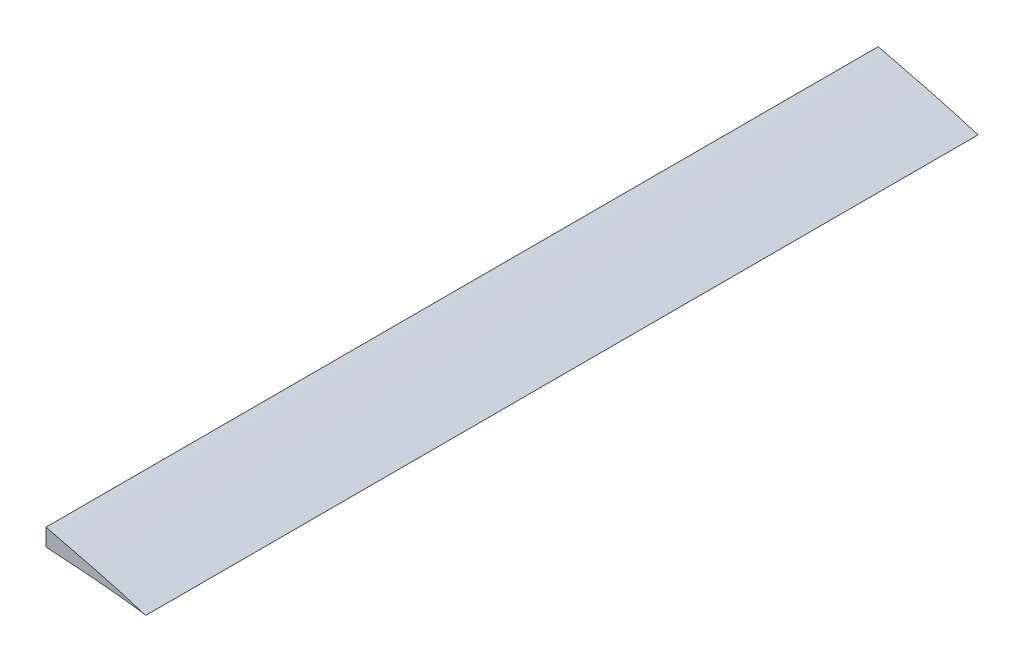
ISO-10303-21;
HEADER;
FILE_DESCRIPTION(('STEP AP214'),'2;1');
FILE_NAME('part.step','',(''),(''),'','','');
FILE_SCHEMA(('AUTOMOTIVE_DESIGN { 1 0 10303 214 1 1 1 1 }'));
ENDSEC;
DATA;
#1=APPLICATION_CONTEXT('core data for automotive mechanical design processes');
#2=APPLICATION_PROTOCOL_DEFINITION('international standard','automotive_design',2000,#1);
#3=PRODUCT_CONTEXT('',#1,'mechanical');
#4=PRODUCT('Part','Part','',(#3));
#5=PRODUCT_RELATED_PRODUCT_CATEGORY('part','',(#4));
#6=PRODUCT_DEFINITION_FORMATION('','',#4);
#7=PRODUCT_DEFINITION_CONTEXT('part definition',#1,'design');
#8=PRODUCT_DEFINITION('design','',#6,#7);
#9=PRODUCT_DEFINITION_SHAPE('','',#8);
#10=(LENGTH_UNIT() NAMED_UNIT(*) SI_UNIT(.MILLI.,.METRE.));
#11=(NAMED_UNIT(*) PLANE_ANGLE_UNIT() SI_UNIT($,.RADIAN.));
#12=(NAMED_UNIT(*) SI_UNIT($,.STERADIAN.) SOLID_ANGLE_UNIT());
#13=UNCERTAINTY_MEASURE_WITH_UNIT(LENGTH_MEASURE(1.E-05),#10,'distance_accuracy_value','');
#14=(GEOMETRIC_REPRESENTATION_CONTEXT(3) GLOBAL_UNCERTAINTY_ASSIGNED_CONTEXT((#13)) GLOBAL_UNIT_ASSIGNED_CONTEXT((#10,
#11,#12)) REPRESENTATION_CONTEXT('',''));
#15=CARTESIAN_POINT('',(0.,0.,0.));
#16=DIRECTION('',(0.,0.,1.));
#17=DIRECTION('',(1.,0.,0.));
#18=AXIS2_PLACEMENT_3D('',#15,#16,#17);
#19=CARTESIAN_POINT('',(122.178284387078,-15.749430179266,112.5));
#20=DIRECTION('',(-1.,0.,0.));
#21=DIRECTION('',(0.,0.,1.));
#22=AXIS2_PLACEMENT_3D('',#19,#20,#21);
#23=PLANE('',#22);
#24=DIRECTION('',(0.,1.,0.));
#25=VECTOR('',#24,1.);
#26=CARTESIAN_POINT('',(122.178284387078,-15.749430179266,112.5));
#27=LINE('',#26,#25);
#28=CARTESIAN_POINT('',(122.178284387078,-13.1755334229377,112.5));
#29=VERTEX_POINT('',#28);
#30=CARTESIAN_POINT('',(122.178284387078,-8.52413692729875,112.5));
#31=VERTEX_POINT('',#30);
#32=EDGE_CURVE('E346',#29,#31,#27,.T.);
#33=ORIENTED_EDGE('',*,*,#32,.F.);
#34=DIRECTION('',(0.,0.,1.));
#35=VECTOR('',#34,1.);
#36=CARTESIAN_POINT('',(122.178284387078,-13.175533422677,-450.));
#37=LINE('',#36,#35);
#38=CARTESIAN_POINT('',(122.178284387078,-13.175533422677,337.5));
#39=VERTEX_POINT('',#38);
#40=EDGE_CURVE('E365',#39,#29,#37,.F.);
#41=ORIENTED_EDGE('',*,*,#40,.F.);
#42=DIRECTION('',(0.,1.,0.));
#43=VECTOR('',#42,1.);
#44=CARTESIAN_POINT('',(122.178284387078,-15.749430179266,337.5));
#45=LINE('',#44,#43);
#46=CARTESIAN_POINT('',(122.178284387078,-8.52413692278096,337.5));
#47=VERTEX_POINT('',#46);
#48=EDGE_CURVE('E347',#39,#47,#45,.T.);
#49=ORIENTED_EDGE('',*,*,#48,.T.);
#50=DIRECTION('',(0.,0.,1.));
#51=VECTOR('',#50,1.);
#52=CARTESIAN_POINT('',(122.178284387078,-8.52413692278096,-450.));
#53=LINE('',#52,#51);
#54=EDGE_CURVE('E372',#31,#47,#53,.T.);
#55=ORIENTED_EDGE('',*,*,#54,.F.);
#56=EDGE_LOOP('',(#33,#41,#49,#55));
#57=FACE_BOUND('',#56,.T.);
#58=DIRECTION('',(0.,0.,1.));
#59=VECTOR('',#58,1.);
#60=CARTESIAN_POINT('',(122.178284387078,-10.449835174991,112.5));
#61=LINE('',#60,#59);
#62=CARTESIAN_POINT('',(122.178284387078,-10.449835174988,222.35));
#63=VERTEX_POINT('',#62);
#64=CARTESIAN_POINT('',(122.178284387078,-10.4498351749878,227.65));
#65=VERTEX_POINT('',#64);
#66=EDGE_CURVE('E392',#63,#65,#61,.T.);
#67=ORIENTED_EDGE('',*,*,#66,.T.);
#68=DIRECTION('',(0.,-1.,-4.85722573273506E-13));
#69=VECTOR('',#68,1.);
#70=CARTESIAN_POINT('',(122.178284387078,-15.7494301793219,227.649999999998));
#71=LINE('',#70,#69);
#72=CARTESIAN_POINT('',(122.178284387078,-11.2498351749878,227.65));
#73=VERTEX_POINT('',#72);
#74=EDGE_CURVE('E396',#65,#73,#71,.T.);
#75=ORIENTED_EDGE('',*,*,#74,.T.);
#76=DIRECTION('',(0.,0.,-1.));
#77=VECTOR('',#76,1.);
#78=CARTESIAN_POINT('',(122.178284387078,-11.2498351749878,112.5));
#79=LINE('',#78,#77);
#80=CARTESIAN_POINT('',(122.178284387078,-11.2498351749878,222.35));
#81=VERTEX_POINT('',#80);
#82=EDGE_CURVE('E381',#73,#81,#79,.T.);
#83=ORIENTED_EDGE('',*,*,#82,.T.);
#84=DIRECTION('',(0.,1.,2.08166817117255E-13));
#85=VECTOR('',#84,1.);
#86=CARTESIAN_POINT('',(122.178284387078,-15.7494301792888,222.349999999999));
#87=LINE('',#86,#85);
#88=EDGE_CURVE('E388',#81,#63,#87,.T.);
#89=ORIENTED_EDGE('',*,*,#88,.T.);
#90=EDGE_LOOP('',(#67,#75,#83,#89));
#91=FACE_BOUND('',#90,.T.);
#92=DIRECTION('',(0.,0.,1.));
#93=VECTOR('',#92,1.);
#94=CARTESIAN_POINT('',(122.178284387078,-10.4498351749921,112.5));
#95=LINE('',#94,#93);
#96=CARTESIAN_POINT('',(122.178284387078,-10.449835174988,262.35));
#97=VERTEX_POINT('',#96);
#98=CARTESIAN_POINT('',(122.178284387078,-10.4498351749878,267.65));
#99=VERTEX_POINT('',#98);
#100=EDGE_CURVE('E406',#97,#99,#95,.T.);
#101=ORIENTED_EDGE('',*,*,#100,.T.);
#102=DIRECTION('',(0.,-1.,-4.85722573273506E-13));
#103=VECTOR('',#102,1.);
#104=CARTESIAN_POINT('',(122.178284387078,-15.7494301793413,267.649999999998));
#105=LINE('',#104,#103);
#106=CARTESIAN_POINT('',(122.178284387078,-11.2498351749878,267.65));
#107=VERTEX_POINT('',#106);
#108=EDGE_CURVE('E410',#99,#107,#105,.T.);
#109=ORIENTED_EDGE('',*,*,#108,.T.);
#110=DIRECTION('',(0.,0.,-1.));
#111=VECTOR('',#110,1.);
#112=CARTESIAN_POINT('',(122.178284387078,-11.2498351749878,112.5));
#113=LINE('',#112,#111);
#114=CARTESIAN_POINT('',(122.178284387078,-11.2498351749878,262.35));
#115=VERTEX_POINT('',#114);
#116=EDGE_CURVE('E207',#107,#115,#113,.T.);
#117=ORIENTED_EDGE('',*,*,#116,.T.);
#118=DIRECTION('',(0.,1.,2.7755575615634E-13));
#119=VECTOR('',#118,1.);
#120=CARTESIAN_POINT('',(122.178284387078,-15.7494301793076,262.349999999999));
#121=LINE('',#120,#119);
#122=EDGE_CURVE('E402',#115,#97,#121,.T.);
#123=ORIENTED_EDGE('',*,*,#122,.T.);
#124=EDGE_LOOP('',(#101,#109,#117,#123));
#125=FACE_BOUND('',#124,.T.);
#126=DIRECTION('',(0.,0.,1.));
#127=VECTOR('',#126,1.);
#128=CARTESIAN_POINT('',(122.178284387078,-10.4498351749932,112.5));
#129=LINE('',#128,#127);
#130=CARTESIAN_POINT('',(122.178284387078,-10.449835174988,302.35));
#131=VERTEX_POINT('',#130);
#132=CARTESIAN_POINT('',(122.178284387078,-10.4498351749878,307.65));
#133=VERTEX_POINT('',#132);
#134=EDGE_CURVE('E421',#131,#133,#129,.T.);
#135=ORIENTED_EDGE('',*,*,#134,.T.);
#136=DIRECTION('',(0.,-1.,-4.85722573273506E-13));
#137=VECTOR('',#136,1.);
#138=CARTESIAN_POINT('',(122.178284387078,-15.7494301793608,307.649999999997));
#139=LINE('',#138,#137);
#140=CARTESIAN_POINT('',(122.178284387078,-11.2498351749878,307.65));
#141=VERTEX_POINT('',#140);
#142=EDGE_CURVE('E425',#133,#141,#139,.T.);
#143=ORIENTED_EDGE('',*,*,#142,.T.);
#144=DIRECTION('',(0.,0.,-1.));
#145=VECTOR('',#144,1.);
#146=CARTESIAN_POINT('',(122.178284387078,-11.2498351749878,112.5));
#147=LINE('',#146,#145);
#148=CARTESIAN_POINT('',(122.178284387078,-11.2498351749878,302.35));
#149=VERTEX_POINT('',#148);
#150=EDGE_CURVE('E413',#141,#149,#147,.T.);
#151=ORIENTED_EDGE('',*,*,#150,.T.);
#152=DIRECTION('',(0.,1.,1.3877787807817E-13));
#153=VECTOR('',#152,1.);
#154=CARTESIAN_POINT('',(122.178284387078,-15.7494301792923,302.349999999999));
#155=LINE('',#154,#153);
#156=EDGE_CURVE('E417',#149,#131,#155,.T.);
#157=ORIENTED_EDGE('',*,*,#156,.T.);
#158=EDGE_LOOP('',(#135,#143,#151,#157));
#159=FACE_BOUND('',#158,.T.);
#160=DIRECTION('',(0.,0.,1.));
#161=VECTOR('',#160,1.);
#162=CARTESIAN_POINT('',(122.178284387078,-10.4498351749902,112.5));
#163=LINE('',#162,#161);
#164=CARTESIAN_POINT('',(122.178284387078,-10.4498351749883,182.350000000001));
#165=VERTEX_POINT('',#164);
#166=CARTESIAN_POINT('',(122.178284387078,-10.4498351749881,187.650000000001));
#167=VERTEX_POINT('',#166);
#168=EDGE_CURVE('E437',#165,#167,#163,.T.);
#169=ORIENTED_EDGE('',*,*,#168,.T.);
#170=DIRECTION('',(0.,-1.,-4.85722573273506E-13));
#171=VECTOR('',#170,1.);
#172=CARTESIAN_POINT('',(122.178284387078,-15.7494301793025,187.649999999998));
#173=LINE('',#172,#171);
#174=CARTESIAN_POINT('',(122.178284387078,-11.2498351749881,187.65));
#175=VERTEX_POINT('',#174);
#176=EDGE_CURVE('E441',#167,#175,#173,.T.);
#177=ORIENTED_EDGE('',*,*,#176,.T.);
#178=DIRECTION('',(0.,0.,-1.));
#179=VECTOR('',#178,1.);
#180=CARTESIAN_POINT('',(122.178284387078,-11.2498351749881,112.5));
#181=LINE('',#180,#179);
#182=CARTESIAN_POINT('',(122.178284387078,-11.2498351749881,182.35));
#183=VERTEX_POINT('',#182);
#184=EDGE_CURVE('E429',#175,#183,#181,.T.);
#185=ORIENTED_EDGE('',*,*,#184,.T.);
#186=DIRECTION('',(0.,1.,2.08166817117255E-13));
#187=VECTOR('',#186,1.);
#188=CARTESIAN_POINT('',(122.178284387078,-15.7494301792805,182.35));
#189=LINE('',#188,#187);
#190=EDGE_CURVE('E433',#183,#165,#189,.T.);
#191=ORIENTED_EDGE('',*,*,#190,.T.);
#192=EDGE_LOOP('',(#169,#177,#185,#191));
#193=FACE_BOUND('',#192,.T.);
#194=DIRECTION('',(0.,0.,1.));
#195=VECTOR('',#194,1.);
#196=CARTESIAN_POINT('',(122.178284387078,-10.4498351749894,112.5));
#197=LINE('',#196,#195);
#198=CARTESIAN_POINT('',(122.178284387078,-10.4498351749885,142.350000000001));
#199=VERTEX_POINT('',#198);
#200=CARTESIAN_POINT('',(122.178284387078,-10.4498351749884,147.650000000001));
#201=VERTEX_POINT('',#200);
#202=EDGE_CURVE('E60',#199,#201,#197,.T.);
#203=ORIENTED_EDGE('',*,*,#202,.T.);
#204=DIRECTION('',(0.,-1.,-4.85722573273506E-13));
#205=VECTOR('',#204,1.);
#206=CARTESIAN_POINT('',(122.178284387078,-15.7494301792831,147.649999999998));
#207=LINE('',#206,#205);
#208=CARTESIAN_POINT('',(122.178284387078,-11.2498351749884,147.65));
#209=VERTEX_POINT('',#208);
#210=EDGE_CURVE('E12',#201,#209,#207,.T.);
#211=ORIENTED_EDGE('',*,*,#210,.T.);
#212=DIRECTION('',(0.,0.,-1.));
#213=VECTOR('',#212,1.);
#214=CARTESIAN_POINT('',(122.178284387078,-11.2498351749884,112.5));
#215=LINE('',#214,#213);
#216=CARTESIAN_POINT('',(122.178284387078,-11.2498351749884,142.350000000001));
#217=VERTEX_POINT('',#216);
#218=EDGE_CURVE('E445',#209,#217,#215,.T.);
#219=ORIENTED_EDGE('',*,*,#218,.T.);
#220=DIRECTION('',(0.,1.,2.08166817117255E-13));
#221=VECTOR('',#220,1.);
#222=CARTESIAN_POINT('',(122.178284387078,-15.7494301792722,142.35));
#223=LINE('',#222,#221);
#224=EDGE_CURVE('E449',#217,#199,#223,.T.);
#225=ORIENTED_EDGE('',*,*,#224,.T.);
#226=EDGE_LOOP('',(#203,#211,#219,#225));
#227=FACE_BOUND('',#226,.T.);
#228=ADVANCED_FACE('F50',(#57,#91,#125,#159,#193,#227),#23,.T.);
#229=CARTESIAN_POINT('',(149.178284305241,-15.6792694901481,-450.));
#230=CARTESIAN_POINT('',(149.178100087813,-15.6693678974795,-450.));
#231=CARTESIAN_POINT('',(147.969720061509,-15.3651295323818,-450.));
#232=CARTESIAN_POINT('',(146.781212520915,-14.9680822798907,-450.));
#233=CARTESIAN_POINT('',(143.973138360998,-14.1294665613949,-450.));
#234=CARTESIAN_POINT('',(140.578240780246,-13.1489330099856,-450.));
#235=CARTESIAN_POINT('',(136.179599697609,-11.9939656405897,-450.));
#236=CARTESIAN_POINT('',(131.008524771713,-10.6763264714993,-450.));
#237=CARTESIAN_POINT('',(125.062627188731,-9.21105738268784,-450.));
#238=CARTESIAN_POINT('',(118.441379392395,-7.62920819086978,-450.));
#239=CARTESIAN_POINT('',(111.219090084423,-5.95942059275848,-450.));
#240=CARTESIAN_POINT('',(103.483361023829,-4.23610961623974,-450.));
#241=CARTESIAN_POINT('',(95.3209441577244,-2.49017043120855,-450.));
#242=CARTESIAN_POINT('',(86.8235461312313,-0.756170375930695,-450.));
#243=CARTESIAN_POINT('',(78.0820935763293,0.934848479799224,-450.));
#244=CARTESIAN_POINT('',(69.1888740860518,2.54637850219202,-450.));
#245=CARTESIAN_POINT('',(60.2360967895881,4.05548647717273,-450.));
#246=CARTESIAN_POINT('',(51.3141034625453,5.42609797503904,-450.));
#247=CARTESIAN_POINT('',(42.5116196050367,6.63850724891066,-450.));
#248=CARTESIAN_POINT('',(33.9137467995349,7.66674257368522,-450.));
#249=CARTESIAN_POINT('',(25.6020406398451,8.49429388362283,-450.));
#250=CARTESIAN_POINT('',(17.6534037086497,9.10852138879261,-450.));
#251=CARTESIAN_POINT('',(10.1388918585595,9.49654419272734,-450.));
#252=CARTESIAN_POINT('',(3.12446065775671,9.65706057100524,-450.));
#253=CARTESIAN_POINT('',(-3.33027234714814,9.58947841648681,-450.));
#254=CARTESIAN_POINT('',(-9.17126556777537,9.30352643365508,-450.));
#255=CARTESIAN_POINT('',(-14.352318755096,8.81648836332029,-450.));
#256=CARTESIAN_POINT('',(-18.8295427368916,8.14299583145136,-450.));
#257=CARTESIAN_POINT('',(-22.5773365766584,7.31366425037325,-450.));
#258=CARTESIAN_POINT('',(-25.5547585188663,6.35023427378556,-450.));
#259=CARTESIAN_POINT('',(-27.7953133672046,5.30799474839756,-450.));
#260=CARTESIAN_POINT('',(-29.1671922204823,4.27123712605213,-450.));
#261=CARTESIAN_POINT('',(-29.8159671162239,3.4545283232752,-450.));
#262=CARTESIAN_POINT('',(-29.8643279407319,2.7227934419072,-450.));
#263=CARTESIAN_POINT('',(-29.1767205232409,1.82674653603546,-450.));
#264=CARTESIAN_POINT('',(-27.571764557693,0.948321734890464,-450.));
#265=CARTESIAN_POINT('',(-25.071050204413,-0.0877740521671509,-450.));
#266=CARTESIAN_POINT('',(-21.6853773570867,-1.07809629439454,-450.));
#267=CARTESIAN_POINT('',(-17.4210481832923,-2.07412183148773,-450.));
#268=CARTESIAN_POINT('',(-12.3134015649488,-3.04392175738155,-450.));
#269=CARTESIAN_POINT('',(-6.40546024177926,-3.9915522429781,-450.));
#270=CARTESIAN_POINT('',(0.242066463729776,-4.91528326080697,-450.));
#271=CARTESIAN_POINT('',(7.56036117487021,-5.8120601277467,-450.));
#272=CARTESIAN_POINT('',(15.4683159977938,-6.67982758630665,-450.));
#273=CARTESIAN_POINT('',(23.8767380547429,-7.51954118675283,-450.));
#274=CARTESIAN_POINT('',(32.6898878962989,-8.32467282972201,-450.));
#275=CARTESIAN_POINT('',(41.8051661378807,-9.09048037340473,-450.));
#276=CARTESIAN_POINT('',(51.1154941474226,-9.80968575021121,-450.));
#277=CARTESIAN_POINT('',(60.5109744173443,-10.4694119570269,-450.));
#278=CARTESIAN_POINT('',(69.9036531918461,-11.0393031302276,-450.));
#279=CARTESIAN_POINT('',(79.2293676474962,-11.4521911310919,-450.));
#280=CARTESIAN_POINT('',(88.4196931031313,-11.7721651701558,-450.));
#281=CARTESIAN_POINT('',(97.381128621822,-12.076327561011,-450.));
#282=CARTESIAN_POINT('',(105.992890973853,-12.3921934316818,-450.));
#283=CARTESIAN_POINT('',(114.126184350614,-12.7431087570136,-450.));
#284=CARTESIAN_POINT('',(121.652964529135,-13.1316199381294,-450.));
#285=CARTESIAN_POINT('',(128.460664010131,-13.5603154189044,-450.));
#286=CARTESIAN_POINT('',(134.413926302031,-14.0065091073509,-450.));
#287=CARTESIAN_POINT('',(139.488067697864,-14.4723832017208,-450.));
#288=CARTESIAN_POINT('',(143.391598904412,-14.8723033412052,-450.));
#289=CARTESIAN_POINT('',(146.576107305367,-15.2904797289583,-450.));
#290=CARTESIAN_POINT('',(147.89278964865,-15.4463370502442,-450.));
#291=CARTESIAN_POINT('',(149.178472526224,-15.6893862718545,-450.));
#292=CARTESIAN_POINT('',(149.178284305241,-15.6792694901481,-450.));
#293=B_SPLINE_CURVE_WITH_KNOTS('',3,(#229,#230,#231,#232,#233,#234,#235,#236,#237,#238,#239,
#240,#241,#242,#243,#244,#245,#246,#247,#248,#249,#250,#251,#252,#253,#254,#255,#256,#257,#258,
#259,#260,#261,#262,#263,#264,#265,#266,#267,#268,#269,#270,#271,#272,#273,#274,#275,#276,#277,
#278,#279,#280,#281,#282,#283,#284,#285,#286,#287,#288,#289,#290,#291,#292),.UNSPECIFIED.,.T.,
.F.,(4,1,1,1,1,1,1,1,1,1,1,1,1,1,1,1,1,1,1,1,1,1,1,1,1,1,1,1,1,1,1,1,1,1,1,1,1,1,1,1,1,1,1,1,1,
1,1,1,1,1,1,1,1,1,1,1,1,1,1,1,1,4),(0.,0.00164785452266832,0.00639797010237706,
0.0138910120582619,0.0238736300812845,0.0363005407334658,0.0510553993244598,0.0679345839748053,
0.0867112737527232,0.107143554182868,0.128994228393114,0.151997212381345,0.17590183187724,
0.200433657182832,0.225338998645853,0.250351670290896,0.275220961992937,0.299693912814144,
0.323543982041593,0.346546993641314,0.368495778864544,0.389210460254572,0.408523229456668,
0.426283737091529,0.442372965072976,0.456684004342913,0.469130372905246,0.479655722259957,
0.488244498344904,0.494928046571547,0.499768593160682,0.502616034200439,0.502853482116261,
0.505768124512993,0.510839243520486,0.518186577711206,0.527884674652775,0.539915214281641,
0.554232386288721,0.570707115971051,0.589198279897448,0.609515424141317,0.631440839759937,
0.654730379995544,0.679124011120686,0.704341366054158,0.73008208654187,0.756046369243305,
0.781927334087976,0.807594660102977,0.832940152366063,0.857679172598889,0.88145736446777,
0.90392867212976,0.924735813856749,0.943553458467275,0.960078250748678,0.974032381174797,
0.985177833260505,0.993329718595483,0.998316333033695,1.),.UNSPECIFIED.);
#294=DIRECTION('',(0.,0.,1.));
#295=VECTOR('',#294,1.);
#296=SURFACE_OF_LINEAR_EXTRUSION('',#293,#295);
#297=CARTESIAN_POINT('',(149.178284305241,-15.6792694901481,337.5));
#298=CARTESIAN_POINT('',(149.178100087813,-15.6693678974795,337.5));
#299=CARTESIAN_POINT('',(147.969720061509,-15.3651295323818,337.5));
#300=CARTESIAN_POINT('',(146.781212520915,-14.9680822798907,337.5));
#301=CARTESIAN_POINT('',(143.973138360998,-14.1294665613949,337.5));
#302=CARTESIAN_POINT('',(140.578240780246,-13.1489330099856,337.5));
#303=CARTESIAN_POINT('',(136.179599697609,-11.9939656405897,337.5));
#304=CARTESIAN_POINT('',(131.008524771713,-10.6763264714993,337.5));
#305=CARTESIAN_POINT('',(125.062627188731,-9.21105738268784,337.5));
#306=CARTESIAN_POINT('',(118.441379392395,-7.62920819086978,337.5));
#307=CARTESIAN_POINT('',(111.219090084423,-5.95942059275848,337.5));
#308=CARTESIAN_POINT('',(103.483361023829,-4.23610961623974,337.5));
#309=CARTESIAN_POINT('',(95.3209441577244,-2.49017043120855,337.5));
#310=CARTESIAN_POINT('',(86.8235461312313,-0.756170375930695,337.5));
#311=CARTESIAN_POINT('',(78.0820935763293,0.934848479799224,337.5));
#312=CARTESIAN_POINT('',(69.1888740860518,2.54637850219202,337.5));
#313=CARTESIAN_POINT('',(60.2360967895881,4.05548647717273,337.5));
#314=CARTESIAN_POINT('',(51.3141034625453,5.42609797503904,337.5));
#315=CARTESIAN_POINT('',(42.5116196050367,6.63850724891066,337.5));
#316=CARTESIAN_POINT('',(33.9137467995349,7.66674257368522,337.5));
#317=CARTESIAN_POINT('',(25.6020406398451,8.49429388362283,337.5));
#318=CARTESIAN_POINT('',(17.6534037086497,9.10852138879261,337.5));
#319=CARTESIAN_POINT('',(10.1388918585595,9.49654419272734,337.5));
#320=CARTESIAN_POINT('',(3.12446065775671,9.65706057100524,337.5));
#321=CARTESIAN_POINT('',(-3.33027234714814,9.58947841648681,337.5));
#322=CARTESIAN_POINT('',(-9.17126556777537,9.30352643365508,337.5));
#323=CARTESIAN_POINT('',(-14.352318755096,8.81648836332029,337.5));
#324=CARTESIAN_POINT('',(-18.8295427368916,8.14299583145136,337.5));
#325=CARTESIAN_POINT('',(-22.5773365766584,7.31366425037325,337.5));
#326=CARTESIAN_POINT('',(-25.5547585188663,6.35023427378556,337.5));
#327=CARTESIAN_POINT('',(-27.7953133672046,5.30799474839756,337.5));
#328=CARTESIAN_POINT('',(-29.1671922204823,4.27123712605213,337.5));
#329=CARTESIAN_POINT('',(-29.8159671162239,3.4545283232752,337.5));
#330=CARTESIAN_POINT('',(-29.8643279407319,2.7227934419072,337.5));
#331=CARTESIAN_POINT('',(-29.1767205232409,1.82674653603546,337.5));
#332=CARTESIAN_POINT('',(-27.571764557693,0.948321734890464,337.5));
#333=CARTESIAN_POINT('',(-25.071050204413,-0.0877740521671509,337.5));
#334=CARTESIAN_POINT('',(-21.6853773570867,-1.07809629439454,337.5));
#335=CARTESIAN_POINT('',(-17.4210481832923,-2.07412183148773,337.5));
#336=CARTESIAN_POINT('',(-12.3134015649488,-3.04392175738155,337.5));
#337=CARTESIAN_POINT('',(-6.40546024177926,-3.9915522429781,337.5));
#338=CARTESIAN_POINT('',(0.242066463729776,-4.91528326080697,337.5));
#339=CARTESIAN_POINT('',(7.56036117487021,-5.8120601277467,337.5));
#340=CARTESIAN_POINT('',(15.4683159977938,-6.67982758630665,337.5));
#341=CARTESIAN_POINT('',(23.8767380547429,-7.51954118675283,337.5));
#342=CARTESIAN_POINT('',(32.6898878962989,-8.32467282972201,337.5));
#343=CARTESIAN_POINT('',(41.8051661378807,-9.09048037340473,337.5));
#344=CARTESIAN_POINT('',(51.1154941474226,-9.80968575021121,337.5));
#345=CARTESIAN_POINT('',(60.5109744173443,-10.4694119570269,337.5));
#346=CARTESIAN_POINT('',(69.9036531918461,-11.0393031302276,337.5));
#347=CARTESIAN_POINT('',(79.2293676474962,-11.4521911310919,337.5));
#348=CARTESIAN_POINT('',(88.4196931031313,-11.7721651701558,337.5));
#349=CARTESIAN_POINT('',(97.381128621822,-12.076327561011,337.5));
#350=CARTESIAN_POINT('',(105.992890973853,-12.3921934316818,337.5));
#351=CARTESIAN_POINT('',(114.126184350614,-12.7431087570136,337.5));
#352=CARTESIAN_POINT('',(121.652964529135,-13.1316199381294,337.5));
#353=CARTESIAN_POINT('',(128.460664010131,-13.5603154189044,337.5));
#354=CARTESIAN_POINT('',(134.413926302031,-14.0065091073509,337.5));
#355=CARTESIAN_POINT('',(139.488067697864,-14.4723832017208,337.5));
#356=CARTESIAN_POINT('',(143.391598904412,-14.8723033412052,337.5));
#357=CARTESIAN_POINT('',(146.576107305367,-15.2904797289583,337.5));
#358=CARTESIAN_POINT('',(147.89278964865,-15.4463370502442,337.5));
#359=CARTESIAN_POINT('',(149.178472526224,-15.6893862718545,337.5));
#360=CARTESIAN_POINT('',(149.178284305241,-15.6792694901481,337.5));
#361=B_SPLINE_CURVE_WITH_KNOTS('',3,(#297,#298,#299,#300,#301,#302,#303,#304,#305,#306,#307,
#308,#309,#310,#311,#312,#313,#314,#315,#316,#317,#318,#319,#320,#321,#322,#323,#324,#325,#326,
#327,#328,#329,#330,#331,#332,#333,#334,#335,#336,#337,#338,#339,#340,#341,#342,#343,#344,#345,
#346,#347,#348,#349,#350,#351,#352,#353,#354,#355,#356,#357,#358,#359,#360),.UNSPECIFIED.,.T.,
.F.,(4,1,1,1,1,1,1,1,1,1,1,1,1,1,1,1,1,1,1,1,1,1,1,1,1,1,1,1,1,1,1,1,1,1,1,1,1,1,1,1,1,1,1,1,1,
1,1,1,1,1,1,1,1,1,1,1,1,1,1,1,1,4),(0.,0.00164785452266832,0.00639797010237706,
0.0138910120582619,0.0238736300812845,0.0363005407334658,0.0510553993244598,0.0679345839748053,
0.0867112737527232,0.107143554182868,0.128994228393114,0.151997212381345,0.17590183187724,
0.200433657182832,0.225338998645853,0.250351670290896,0.275220961992937,0.299693912814144,
0.323543982041593,0.346546993641314,0.368495778864544,0.389210460254572,0.408523229456668,
0.426283737091529,0.442372965072976,0.456684004342913,0.469130372905246,0.479655722259957,
0.488244498344904,0.494928046571547,0.499768593160682,0.502616034200439,0.502853482116261,
0.505768124512993,0.510839243520486,0.518186577711206,0.527884674652775,0.539915214281641,
0.554232386288721,0.570707115971051,0.589198279897448,0.609515424141317,0.631440839759937,
0.654730379995544,0.679124011120686,0.704341366054158,0.73008208654187,0.756046369243305,
0.781927334087976,0.807594660102977,0.832940152366063,0.857679172598889,0.88145736446777,
0.90392867212976,0.924735813856749,0.943553458467275,0.960078250748678,0.974032381174797,
0.985177833260505,0.993329718595483,0.998316333033695,1.),.UNSPECIFIED.);
#362=EDGE_CURVE('E376',#47,#39,#361,.F.);
#363=ORIENTED_EDGE('',*,*,#362,.T.);
#364=ORIENTED_EDGE('',*,*,#40,.T.);
#365=CARTESIAN_POINT('',(149.178284305241,-15.6792694901481,112.5));
#366=CARTESIAN_POINT('',(149.178100087813,-15.6693678974795,112.5));
#367=CARTESIAN_POINT('',(147.969720061509,-15.3651295323818,112.5));
#368=CARTESIAN_POINT('',(146.781212520915,-14.9680822798907,112.5));
#369=CARTESIAN_POINT('',(143.973138360998,-14.1294665613949,112.5));
#370=CARTESIAN_POINT('',(140.578240780246,-13.1489330099856,112.5));
#371=CARTESIAN_POINT('',(136.179599697609,-11.9939656405897,112.5));
#372=CARTESIAN_POINT('',(131.008524771713,-10.6763264714993,112.5));
#373=CARTESIAN_POINT('',(125.062627188731,-9.21105738268784,112.5));
#374=CARTESIAN_POINT('',(118.441379392395,-7.62920819086978,112.5));
#375=CARTESIAN_POINT('',(111.219090084423,-5.95942059275848,112.5));
#376=CARTESIAN_POINT('',(103.483361023829,-4.23610961623974,112.5));
#377=CARTESIAN_POINT('',(95.3209441577244,-2.49017043120855,112.5));
#378=CARTESIAN_POINT('',(86.8235461312313,-0.756170375930695,112.5));
#379=CARTESIAN_POINT('',(78.0820935763293,0.934848479799224,112.5));
#380=CARTESIAN_POINT('',(69.1888740860518,2.54637850219202,112.5));
#381=CARTESIAN_POINT('',(60.2360967895881,4.05548647717273,112.5));
#382=CARTESIAN_POINT('',(51.3141034625453,5.42609797503904,112.5));
#383=CARTESIAN_POINT('',(42.5116196050367,6.63850724891066,112.5));
#384=CARTESIAN_POINT('',(33.9137467995349,7.66674257368522,112.5));
#385=CARTESIAN_POINT('',(25.6020406398451,8.49429388362283,112.5));
#386=CARTESIAN_POINT('',(17.6534037086497,9.10852138879261,112.5));
#387=CARTESIAN_POINT('',(10.1388918585595,9.49654419272734,112.5));
#388=CARTESIAN_POINT('',(3.12446065775671,9.65706057100524,112.5));
#389=CARTESIAN_POINT('',(-3.33027234714814,9.58947841648681,112.5));
#390=CARTESIAN_POINT('',(-9.17126556777537,9.30352643365508,112.5));
#391=CARTESIAN_POINT('',(-14.352318755096,8.81648836332029,112.5));
#392=CARTESIAN_POINT('',(-18.8295427368916,8.14299583145136,112.5));
#393=CARTESIAN_POINT('',(-22.5773365766584,7.31366425037325,112.5));
#394=CARTESIAN_POINT('',(-25.5547585188663,6.35023427378556,112.5));
#395=CARTESIAN_POINT('',(-27.7953133672046,5.30799474839756,112.5));
#396=CARTESIAN_POINT('',(-29.1671922204823,4.27123712605213,112.5));
#397=CARTESIAN_POINT('',(-29.8159671162239,3.4545283232752,112.5));
#398=CARTESIAN_POINT('',(-29.8643279407319,2.7227934419072,112.5));
#399=CARTESIAN_POINT('',(-29.1767205232409,1.82674653603546,112.5));
#400=CARTESIAN_POINT('',(-27.571764557693,0.948321734890464,112.5));
#401=CARTESIAN_POINT('',(-25.071050204413,-0.0877740521671509,112.5));
#402=CARTESIAN_POINT('',(-21.6853773570867,-1.07809629439454,112.5));
#403=CARTESIAN_POINT('',(-17.4210481832923,-2.07412183148773,112.5));
#404=CARTESIAN_POINT('',(-12.3134015649488,-3.04392175738155,112.5));
#405=CARTESIAN_POINT('',(-6.40546024177926,-3.9915522429781,112.5));
#406=CARTESIAN_POINT('',(0.242066463729776,-4.91528326080697,112.5));
#407=CARTESIAN_POINT('',(7.56036117487021,-5.8120601277467,112.5));
#408=CARTESIAN_POINT('',(15.4683159977938,-6.67982758630665,112.5));
#409=CARTESIAN_POINT('',(23.8767380547429,-7.51954118675283,112.5));
#410=CARTESIAN_POINT('',(32.6898878962989,-8.32467282972201,112.5));
#411=CARTESIAN_POINT('',(41.8051661378807,-9.09048037340473,112.5));
#412=CARTESIAN_POINT('',(51.1154941474226,-9.80968575021121,112.5));
#413=CARTESIAN_POINT('',(60.5109744173443,-10.4694119570269,112.5));
#414=CARTESIAN_POINT('',(69.9036531918461,-11.0393031302276,112.5));
#415=CARTESIAN_POINT('',(79.2293676474962,-11.4521911310919,112.5));
#416=CARTESIAN_POINT('',(88.4196931031313,-11.7721651701558,112.5));
#417=CARTESIAN_POINT('',(97.381128621822,-12.076327561011,112.5));
#418=CARTESIAN_POINT('',(105.992890973853,-12.3921934316818,112.5));
#419=CARTESIAN_POINT('',(114.126184350614,-12.7431087570136,112.5));
#420=CARTESIAN_POINT('',(121.652964529135,-13.1316199381294,112.5));
#421=CARTESIAN_POINT('',(128.460664010131,-13.5603154189044,112.5));
#422=CARTESIAN_POINT('',(134.413926302031,-14.0065091073509,112.5));
#423=CARTESIAN_POINT('',(139.488067697864,-14.4723832017208,112.5));
#424=CARTESIAN_POINT('',(143.391598904412,-14.8723033412052,112.5));
#425=CARTESIAN_POINT('',(146.576107305367,-15.2904797289583,112.5));
#426=CARTESIAN_POINT('',(147.89278964865,-15.4463370502442,112.5));
#427=CARTESIAN_POINT('',(149.178472526224,-15.6893862718545,112.5));
#428=CARTESIAN_POINT('',(149.178284305241,-15.6792694901481,112.5));
#429=B_SPLINE_CURVE_WITH_KNOTS('',3,(#365,#366,#367,#368,#369,#370,#371,#372,#373,#374,#375,
#376,#377,#378,#379,#380,#381,#382,#383,#384,#385,#386,#387,#388,#389,#390,#391,#392,#393,#394,
#395,#396,#397,#398,#399,#400,#401,#402,#403,#404,#405,#406,#407,#408,#409,#410,#411,#412,#413,
#414,#415,#416,#417,#418,#419,#420,#421,#422,#423,#424,#425,#426,#427,#428),.UNSPECIFIED.,.T.,
.F.,(4,1,1,1,1,1,1,1,1,1,1,1,1,1,1,1,1,1,1,1,1,1,1,1,1,1,1,1,1,1,1,1,1,1,1,1,1,1,1,1,1,1,1,1,1,
1,1,1,1,1,1,1,1,1,1,1,1,1,1,1,1,4),(0.,0.00164785452266832,0.00639797010237706,
0.0138910120582619,0.0238736300812845,0.0363005407334658,0.0510553993244598,0.0679345839748053,
0.0867112737527232,0.107143554182868,0.128994228393114,0.151997212381345,0.17590183187724,
0.200433657182832,0.225338998645853,0.250351670290896,0.275220961992937,0.299693912814144,
0.323543982041593,0.346546993641314,0.368495778864544,0.389210460254572,0.408523229456668,
0.426283737091529,0.442372965072976,0.456684004342913,0.469130372905246,0.479655722259957,
0.488244498344904,0.494928046571547,0.499768593160682,0.502616034200439,0.502853482116261,
0.505768124512993,0.510839243520486,0.518186577711206,0.527884674652775,0.539915214281641,
0.554232386288721,0.570707115971051,0.589198279897448,0.609515424141317,0.631440839759937,
0.654730379995544,0.679124011120686,0.704341366054158,0.73008208654187,0.756046369243305,
0.781927334087976,0.807594660102977,0.832940152366063,0.857679172598889,0.88145736446777,
0.90392867212976,0.924735813856749,0.943553458467275,0.960078250748678,0.974032381174797,
0.985177833260505,0.993329718595483,0.998316333033695,1.),.UNSPECIFIED.);
#430=EDGE_CURVE('E351',#29,#31,#429,.T.);
#431=ORIENTED_EDGE('',*,*,#430,.T.);
#432=ORIENTED_EDGE('',*,*,#54,.T.);
#433=EDGE_LOOP('',(#363,#364,#431,#432));
#434=FACE_BOUND('',#433,.T.);
#435=ADVANCED_FACE('F52',(#434),#296,.T.);
#436=CARTESIAN_POINT('',(149.178284387077,-15.749430179266,337.5));
#437=DIRECTION('',(0.,0.,1.));
#438=DIRECTION('',(1.,0.,0.));
#439=AXIS2_PLACEMENT_3D('',#436,#437,#438);
#440=PLANE('',#439);
#441=ORIENTED_EDGE('',*,*,#362,.F.);
#442=ORIENTED_EDGE('',*,*,#48,.F.);
#443=EDGE_LOOP('',(#441,#442));
#444=FACE_BOUND('',#443,.T.);
#445=ADVANCED_FACE('F486',(#444),#440,.T.);
#446=CARTESIAN_POINT('',(149.178284387077,-15.749430179266,112.5));
#447=DIRECTION('',(0.,0.,-1.));
#448=DIRECTION('',(-1.,0.,0.));
#449=AXIS2_PLACEMENT_3D('',#446,#447,#448);
#450=PLANE('',#449);
#451=ORIENTED_EDGE('',*,*,#430,.F.);
#452=ORIENTED_EDGE('',*,*,#32,.T.);
#453=EDGE_LOOP('',(#451,#452));
#454=FACE_BOUND('',#453,.T.);
#455=ADVANCED_FACE('F492',(#454),#450,.T.);
#456=CARTESIAN_POINT('',(122.178272387078,-11.2498351749878,227.65));
#457=DIRECTION('',(0.,4.85722573273506E-13,-1.));
#458=DIRECTION('',(0.,1.,4.85722573273506E-13));
#459=AXIS2_PLACEMENT_3D('',#456,#457,#458);
#460=PLANE('',#459);
#461=DIRECTION('',(1.,0.,0.));
#462=VECTOR('',#461,1.);
#463=CARTESIAN_POINT('',(122.178272387078,-10.4498351749878,227.65));
#464=LINE('',#463,#462);
#465=CARTESIAN_POINT('',(127.178284387078,-10.4498351749878,227.65));
#466=VERTEX_POINT('',#465);
#467=EDGE_CURVE('E343',#65,#466,#464,.T.);
#468=ORIENTED_EDGE('',*,*,#467,.T.);
#469=DIRECTION('',(0.,1.,4.85722573273506E-13));
#470=VECTOR('',#469,1.);
#471=CARTESIAN_POINT('',(127.178284387078,-11.2498351749878,227.65));
#472=LINE('',#471,#470);
#473=CARTESIAN_POINT('',(127.178284387078,-11.2498351749878,227.65));
#474=VERTEX_POINT('',#473);
#475=EDGE_CURVE('E222',#474,#466,#472,.T.);
#476=ORIENTED_EDGE('',*,*,#475,.F.);
#477=DIRECTION('',(1.,0.,0.));
#478=VECTOR('',#477,1.);
#479=CARTESIAN_POINT('',(122.178272387078,-11.2498351749878,227.65));
#480=LINE('',#479,#478);
#481=EDGE_CURVE('E334',#73,#474,#480,.T.);
#482=ORIENTED_EDGE('',*,*,#481,.F.);
#483=ORIENTED_EDGE('',*,*,#74,.F.);
#484=EDGE_LOOP('',(#468,#476,#482,#483));
#485=FACE_BOUND('',#484,.T.);
#486=ADVANCED_FACE('F493',(#485),#460,.T.);
#487=CARTESIAN_POINT('',(122.178272387078,-10.449835174988,222.35));
#488=DIRECTION('',(0.,-1.,0.));
#489=DIRECTION('',(0.,0.,-1.));
#490=AXIS2_PLACEMENT_3D('',#487,#488,#489);
#491=PLANE('',#490);
#492=DIRECTION('',(1.,0.,0.));
#493=VECTOR('',#492,1.);
#494=CARTESIAN_POINT('',(122.178272387078,-10.449835174988,222.35));
#495=LINE('',#494,#493);
#496=CARTESIAN_POINT('',(127.178284387078,-10.449835174988,222.35));
#497=VERTEX_POINT('',#496);
#498=EDGE_CURVE('E340',#63,#497,#495,.T.);
#499=ORIENTED_EDGE('',*,*,#498,.T.);
#500=DIRECTION('',(0.,0.,-1.));
#501=VECTOR('',#500,1.);
#502=CARTESIAN_POINT('',(127.178284387078,-10.449835174988,222.35));
#503=LINE('',#502,#501);
#504=EDGE_CURVE('E322',#466,#497,#503,.T.);
#505=ORIENTED_EDGE('',*,*,#504,.F.);
#506=ORIENTED_EDGE('',*,*,#467,.F.);
#507=ORIENTED_EDGE('',*,*,#66,.F.);
#508=EDGE_LOOP('',(#499,#505,#506,#507));
#509=FACE_BOUND('',#508,.T.);
#510=ADVANCED_FACE('F498',(#509),#491,.T.);
#511=CARTESIAN_POINT('',(122.178272387078,-11.2498351749878,222.35));
#512=DIRECTION('',(0.,-2.08166817117255E-13,1.));
#513=DIRECTION('',(0.,-1.,-2.08166817117255E-13));
#514=AXIS2_PLACEMENT_3D('',#511,#512,#513);
#515=PLANE('',#514);
#516=DIRECTION('',(1.,0.,0.));
#517=VECTOR('',#516,1.);
#518=CARTESIAN_POINT('',(122.178272387078,-11.2498351749878,222.35));
#519=LINE('',#518,#517);
#520=CARTESIAN_POINT('',(127.178284387078,-11.2498351749878,222.35));
#521=VERTEX_POINT('',#520);
#522=EDGE_CURVE('E337',#81,#521,#519,.T.);
#523=ORIENTED_EDGE('',*,*,#522,.T.);
#524=DIRECTION('',(0.,-1.,-2.08166817117255E-13));
#525=VECTOR('',#524,1.);
#526=CARTESIAN_POINT('',(127.178284387078,-11.2498351749878,222.35));
#527=LINE('',#526,#525);
#528=EDGE_CURVE('E326',#497,#521,#527,.T.);
#529=ORIENTED_EDGE('',*,*,#528,.F.);
#530=ORIENTED_EDGE('',*,*,#498,.F.);
#531=ORIENTED_EDGE('',*,*,#88,.F.);
#532=EDGE_LOOP('',(#523,#529,#530,#531));
#533=FACE_BOUND('',#532,.T.);
#534=ADVANCED_FACE('F534',(#533),#515,.T.);
#535=CARTESIAN_POINT('',(122.178272387078,-11.2498351749878,222.35));
#536=DIRECTION('',(0.,1.,0.));
#537=DIRECTION('',(0.,0.,1.));
#538=AXIS2_PLACEMENT_3D('',#535,#536,#537);
#539=PLANE('',#538);
#540=ORIENTED_EDGE('',*,*,#481,.T.);
#541=DIRECTION('',(0.,0.,1.));
#542=VECTOR('',#541,1.);
#543=CARTESIAN_POINT('',(127.178284387078,-11.2498351749878,222.35));
#544=LINE('',#543,#542);
#545=EDGE_CURVE('E330',#521,#474,#544,.T.);
#546=ORIENTED_EDGE('',*,*,#545,.F.);
#547=ORIENTED_EDGE('',*,*,#522,.F.);
#548=ORIENTED_EDGE('',*,*,#82,.F.);
#549=EDGE_LOOP('',(#540,#546,#547,#548));
#550=FACE_BOUND('',#549,.T.);
#551=ADVANCED_FACE('F543',(#550),#539,.T.);
#552=CARTESIAN_POINT('',(127.178284387078,0.,0.));
#553=DIRECTION('',(1.,0.,0.));
#554=DIRECTION('',(0.,0.,-1.));
#555=AXIS2_PLACEMENT_3D('',#552,#553,#554);
#556=PLANE('',#555);
#557=ORIENTED_EDGE('',*,*,#475,.T.);
#558=ORIENTED_EDGE('',*,*,#504,.T.);
#559=ORIENTED_EDGE('',*,*,#528,.T.);
#560=ORIENTED_EDGE('',*,*,#545,.T.);
#561=EDGE_LOOP('',(#557,#558,#559,#560));
#562=FACE_BOUND('',#561,.T.);
#563=ADVANCED_FACE('F552',(#562),#556,.F.);
#564=CARTESIAN_POINT('',(122.178272387078,-11.2498351749878,267.65));
#565=DIRECTION('',(0.,4.85722573273506E-13,-1.));
#566=DIRECTION('',(0.,1.,4.85722573273506E-13));
#567=AXIS2_PLACEMENT_3D('',#564,#565,#566);
#568=PLANE('',#567);
#569=DIRECTION('',(1.,0.,0.));
#570=VECTOR('',#569,1.);
#571=CARTESIAN_POINT('',(122.178272387078,-10.4498351749878,267.65));
#572=LINE('',#571,#570);
#573=CARTESIAN_POINT('',(127.178284387078,-10.4498351749878,267.65));
#574=VERTEX_POINT('',#573);
#575=EDGE_CURVE('E217',#99,#574,#572,.T.);
#576=ORIENTED_EDGE('',*,*,#575,.T.);
#577=DIRECTION('',(0.,1.,4.85722573273506E-13));
#578=VECTOR('',#577,1.);
#579=CARTESIAN_POINT('',(127.178284387078,-11.2498351749878,267.65));
#580=LINE('',#579,#578);
#581=CARTESIAN_POINT('',(127.178284387078,-11.2498351749878,267.65));
#582=VERTEX_POINT('',#581);
#583=EDGE_CURVE('E214',#582,#574,#580,.T.);
#584=ORIENTED_EDGE('',*,*,#583,.F.);
#585=DIRECTION('',(1.,0.,0.));
#586=VECTOR('',#585,1.);
#587=CARTESIAN_POINT('',(122.178272387078,-11.2498351749878,267.65));
#588=LINE('',#587,#586);
#589=EDGE_CURVE('E201',#107,#582,#588,.T.);
#590=ORIENTED_EDGE('',*,*,#589,.F.);
#591=ORIENTED_EDGE('',*,*,#108,.F.);
#592=EDGE_LOOP('',(#576,#584,#590,#591));
#593=FACE_BOUND('',#592,.T.);
#594=ADVANCED_FACE('F215',(#593),#568,.T.);
#595=CARTESIAN_POINT('',(122.178272387078,-10.449835174988,262.35));
#596=DIRECTION('',(0.,-1.,0.));
#597=DIRECTION('',(0.,0.,-1.));
#598=AXIS2_PLACEMENT_3D('',#595,#596,#597);
#599=PLANE('',#598);
#600=DIRECTION('',(1.,0.,0.));
#601=VECTOR('',#600,1.);
#602=CARTESIAN_POINT('',(122.178272387078,-10.449835174988,262.35));
#603=LINE('',#602,#601);
#604=CARTESIAN_POINT('',(127.178284387078,-10.449835174988,262.35));
#605=VERTEX_POINT('',#604);
#606=EDGE_CURVE('E763',#97,#605,#603,.T.);
#607=ORIENTED_EDGE('',*,*,#606,.T.);
#608=DIRECTION('',(0.,0.,-1.));
#609=VECTOR('',#608,1.);
#610=CARTESIAN_POINT('',(127.178284387078,-10.449835174988,262.35));
#611=LINE('',#610,#609);
#612=EDGE_CURVE('E223',#574,#605,#611,.T.);
#613=ORIENTED_EDGE('',*,*,#612,.F.);
#614=ORIENTED_EDGE('',*,*,#575,.F.);
#615=ORIENTED_EDGE('',*,*,#100,.F.);
#616=EDGE_LOOP('',(#607,#613,#614,#615));
#617=FACE_BOUND('',#616,.T.);
#618=ADVANCED_FACE('F569',(#617),#599,.T.);
#619=CARTESIAN_POINT('',(122.178272387078,-11.2498351749878,262.35));
#620=DIRECTION('',(0.,-2.7755575615634E-13,1.));
#621=DIRECTION('',(0.,-1.,-2.7755575615634E-13));
#622=AXIS2_PLACEMENT_3D('',#619,#620,#621);
#623=PLANE('',#622);
#624=DIRECTION('',(1.,0.,0.));
#625=VECTOR('',#624,1.);
#626=CARTESIAN_POINT('',(122.178272387078,-11.2498351749878,262.35));
#627=LINE('',#626,#625);
#628=CARTESIAN_POINT('',(127.178284387078,-11.2498351749878,262.35));
#629=VERTEX_POINT('',#628);
#630=EDGE_CURVE('E211',#115,#629,#627,.T.);
#631=ORIENTED_EDGE('',*,*,#630,.T.);
#632=DIRECTION('',(0.,-1.,-2.7755575615634E-13));
#633=VECTOR('',#632,1.);
#634=CARTESIAN_POINT('',(127.178284387078,-11.2498351749878,262.35));
#635=LINE('',#634,#633);
#636=EDGE_CURVE('E228',#605,#629,#635,.T.);
#637=ORIENTED_EDGE('',*,*,#636,.F.);
#638=ORIENTED_EDGE('',*,*,#606,.F.);
#639=ORIENTED_EDGE('',*,*,#122,.F.);
#640=EDGE_LOOP('',(#631,#637,#638,#639));
#641=FACE_BOUND('',#640,.T.);
#642=ADVANCED_FACE('F577',(#641),#623,.T.);
#643=CARTESIAN_POINT('',(122.178272387078,-11.2498351749878,262.35));
#644=DIRECTION('',(0.,1.,0.));
#645=DIRECTION('',(0.,0.,1.));
#646=AXIS2_PLACEMENT_3D('',#643,#644,#645);
#647=PLANE('',#646);
#648=ORIENTED_EDGE('',*,*,#589,.T.);
#649=DIRECTION('',(0.,0.,1.));
#650=VECTOR('',#649,1.);
#651=CARTESIAN_POINT('',(127.178284387078,-11.2498351749878,262.35));
#652=LINE('',#651,#650);
#653=EDGE_CURVE('E205',#629,#582,#652,.T.);
#654=ORIENTED_EDGE('',*,*,#653,.F.);
#655=ORIENTED_EDGE('',*,*,#630,.F.);
#656=ORIENTED_EDGE('',*,*,#116,.F.);
#657=EDGE_LOOP('',(#648,#654,#655,#656));
#658=FACE_BOUND('',#657,.T.);
#659=ADVANCED_FACE('F203',(#658),#647,.T.);
#660=CARTESIAN_POINT('',(127.178284387078,0.,0.));
#661=DIRECTION('',(1.,0.,0.));
#662=DIRECTION('',(0.,0.,-1.));
#663=AXIS2_PLACEMENT_3D('',#660,#661,#662);
#664=PLANE('',#663);
#665=ORIENTED_EDGE('',*,*,#583,.T.);
#666=ORIENTED_EDGE('',*,*,#612,.T.);
#667=ORIENTED_EDGE('',*,*,#636,.T.);
#668=ORIENTED_EDGE('',*,*,#653,.T.);
#669=EDGE_LOOP('',(#665,#666,#667,#668));
#670=FACE_BOUND('',#669,.T.);
#671=ADVANCED_FACE('F226',(#670),#664,.F.);
#672=CARTESIAN_POINT('',(122.178272387078,-11.2498351749878,307.65));
#673=DIRECTION('',(0.,4.85722573273506E-13,-1.));
#674=DIRECTION('',(0.,1.,4.85722573273506E-13));
#675=AXIS2_PLACEMENT_3D('',#672,#673,#674);
#676=PLANE('',#675);
#677=DIRECTION('',(1.,0.,0.));
#678=VECTOR('',#677,1.);
#679=CARTESIAN_POINT('',(122.178272387078,-10.4498351749878,307.65));
#680=LINE('',#679,#678);
#681=CARTESIAN_POINT('',(127.178284387078,-10.4498351749878,307.65));
#682=VERTEX_POINT('',#681);
#683=EDGE_CURVE('E237',#133,#682,#680,.T.);
#684=ORIENTED_EDGE('',*,*,#683,.T.);
#685=DIRECTION('',(0.,1.,4.85722573273506E-13));
#686=VECTOR('',#685,1.);
#687=CARTESIAN_POINT('',(127.178284387078,-11.2498351749878,307.65));
#688=LINE('',#687,#686);
#689=CARTESIAN_POINT('',(127.178284387078,-11.2498351749878,307.65));
#690=VERTEX_POINT('',#689);
#691=EDGE_CURVE('E262',#690,#682,#688,.T.);
#692=ORIENTED_EDGE('',*,*,#691,.F.);
#693=DIRECTION('',(1.,0.,0.));
#694=VECTOR('',#693,1.);
#695=CARTESIAN_POINT('',(122.178272387078,-11.2498351749878,307.65));
#696=LINE('',#695,#694);
#697=EDGE_CURVE('E247',#141,#690,#696,.T.);
#698=ORIENTED_EDGE('',*,*,#697,.F.);
#699=ORIENTED_EDGE('',*,*,#142,.F.);
#700=EDGE_LOOP('',(#684,#692,#698,#699));
#701=FACE_BOUND('',#700,.T.);
#702=ADVANCED_FACE('F601',(#701),#676,.T.);
#703=CARTESIAN_POINT('',(122.178272387078,-10.449835174988,302.35));
#704=DIRECTION('',(0.,-1.,0.));
#705=DIRECTION('',(0.,0.,-1.));
#706=AXIS2_PLACEMENT_3D('',#703,#704,#705);
#707=PLANE('',#706);
#708=DIRECTION('',(1.,0.,0.));
#709=VECTOR('',#708,1.);
#710=CARTESIAN_POINT('',(122.178272387078,-10.449835174988,302.35));
#711=LINE('',#710,#709);
#712=CARTESIAN_POINT('',(127.178284387078,-10.449835174988,302.35));
#713=VERTEX_POINT('',#712);
#714=EDGE_CURVE('E240',#131,#713,#711,.T.);
#715=ORIENTED_EDGE('',*,*,#714,.T.);
#716=DIRECTION('',(0.,0.,-1.));
#717=VECTOR('',#716,1.);
#718=CARTESIAN_POINT('',(127.178284387078,-10.449835174988,302.35));
#719=LINE('',#718,#717);
#720=EDGE_CURVE('E258',#682,#713,#719,.T.);
#721=ORIENTED_EDGE('',*,*,#720,.F.);
#722=ORIENTED_EDGE('',*,*,#683,.F.);
#723=ORIENTED_EDGE('',*,*,#134,.F.);
#724=EDGE_LOOP('',(#715,#721,#722,#723));
#725=FACE_BOUND('',#724,.T.);
#726=ADVANCED_FACE('F609',(#725),#707,.T.);
#727=CARTESIAN_POINT('',(122.178272387078,-11.2498351749878,302.35));
#728=DIRECTION('',(0.,-1.3877787807817E-13,1.));
#729=DIRECTION('',(0.,-1.,-1.3877787807817E-13));
#730=AXIS2_PLACEMENT_3D('',#727,#728,#729);
#731=PLANE('',#730);
#732=DIRECTION('',(1.,0.,0.));
#733=VECTOR('',#732,1.);
#734=CARTESIAN_POINT('',(122.178272387078,-11.2498351749878,302.35));
#735=LINE('',#734,#733);
#736=CARTESIAN_POINT('',(127.178284387078,-11.2498351749878,302.35));
#737=VERTEX_POINT('',#736);
#738=EDGE_CURVE('E244',#149,#737,#735,.T.);
#739=ORIENTED_EDGE('',*,*,#738,.T.);
#740=DIRECTION('',(0.,-1.,-1.3877787807817E-13));
#741=VECTOR('',#740,1.);
#742=CARTESIAN_POINT('',(127.178284387078,-11.2498351749878,302.35));
#743=LINE('',#742,#741);
#744=EDGE_CURVE('E254',#713,#737,#743,.T.);
#745=ORIENTED_EDGE('',*,*,#744,.F.);
#746=ORIENTED_EDGE('',*,*,#714,.F.);
#747=ORIENTED_EDGE('',*,*,#156,.F.);
#748=EDGE_LOOP('',(#739,#745,#746,#747));
#749=FACE_BOUND('',#748,.T.);
#750=ADVANCED_FACE('F618',(#749),#731,.T.);
#751=CARTESIAN_POINT('',(122.178272387078,-11.2498351749878,302.35));
#752=DIRECTION('',(0.,1.,0.));
#753=DIRECTION('',(0.,0.,1.));
#754=AXIS2_PLACEMENT_3D('',#751,#752,#753);
#755=PLANE('',#754);
#756=ORIENTED_EDGE('',*,*,#697,.T.);
#757=DIRECTION('',(0.,0.,1.));
#758=VECTOR('',#757,1.);
#759=CARTESIAN_POINT('',(127.178284387078,-11.2498351749878,302.35));
#760=LINE('',#759,#758);
#761=EDGE_CURVE('E250',#737,#690,#760,.T.);
#762=ORIENTED_EDGE('',*,*,#761,.F.);
#763=ORIENTED_EDGE('',*,*,#738,.F.);
#764=ORIENTED_EDGE('',*,*,#150,.F.);
#765=EDGE_LOOP('',(#756,#762,#763,#764));
#766=FACE_BOUND('',#765,.T.);
#767=ADVANCED_FACE('F627',(#766),#755,.T.);
#768=CARTESIAN_POINT('',(127.178284387078,0.,0.));
#769=DIRECTION('',(1.,0.,0.));
#770=DIRECTION('',(0.,0.,-1.));
#771=AXIS2_PLACEMENT_3D('',#768,#769,#770);
#772=PLANE('',#771);
#773=ORIENTED_EDGE('',*,*,#691,.T.);
#774=ORIENTED_EDGE('',*,*,#720,.T.);
#775=ORIENTED_EDGE('',*,*,#744,.T.);
#776=ORIENTED_EDGE('',*,*,#761,.T.);
#777=EDGE_LOOP('',(#773,#774,#775,#776));
#778=FACE_BOUND('',#777,.T.);
#779=ADVANCED_FACE('F636',(#778),#772,.F.);
#780=CARTESIAN_POINT('',(122.178272387078,-11.2498351749881,187.65));
#781=DIRECTION('',(0.,4.85722573273506E-13,-1.));
#782=DIRECTION('',(0.,1.,4.85722573273506E-13));
#783=AXIS2_PLACEMENT_3D('',#780,#781,#782);
#784=PLANE('',#783);
#785=DIRECTION('',(1.,0.,0.));
#786=VECTOR('',#785,1.);
#787=CARTESIAN_POINT('',(122.178272387078,-10.4498351749881,187.650000000001));
#788=LINE('',#787,#786);
#789=CARTESIAN_POINT('',(127.178284387078,-10.4498351749881,187.650000000001));
#790=VERTEX_POINT('',#789);
#791=EDGE_CURVE('E266',#167,#790,#788,.T.);
#792=ORIENTED_EDGE('',*,*,#791,.T.);
#793=DIRECTION('',(0.,1.,4.85722573273506E-13));
#794=VECTOR('',#793,1.);
#795=CARTESIAN_POINT('',(127.178284387078,-11.2498351749881,187.65));
#796=LINE('',#795,#794);
#797=CARTESIAN_POINT('',(127.178284387078,-11.2498351749881,187.65));
#798=VERTEX_POINT('',#797);
#799=EDGE_CURVE('E241',#798,#790,#796,.T.);
#800=ORIENTED_EDGE('',*,*,#799,.F.);
#801=DIRECTION('',(1.,0.,0.));
#802=VECTOR('',#801,1.);
#803=CARTESIAN_POINT('',(122.178272387078,-11.2498351749881,187.65));
#804=LINE('',#803,#802);
#805=EDGE_CURVE('E275',#175,#798,#804,.T.);
#806=ORIENTED_EDGE('',*,*,#805,.F.);
#807=ORIENTED_EDGE('',*,*,#176,.F.);
#808=EDGE_LOOP('',(#792,#800,#806,#807));
#809=FACE_BOUND('',#808,.T.);
#810=ADVANCED_FACE('F645',(#809),#784,.T.);
#811=CARTESIAN_POINT('',(122.178272387078,-10.4498351749883,182.350000000001));
#812=DIRECTION('',(0.,-1.,0.));
#813=DIRECTION('',(0.,0.,-1.));
#814=AXIS2_PLACEMENT_3D('',#811,#812,#813);
#815=PLANE('',#814);
#816=DIRECTION('',(1.,0.,0.));
#817=VECTOR('',#816,1.);
#818=CARTESIAN_POINT('',(122.178272387078,-10.4498351749883,182.350000000001));
#819=LINE('',#818,#817);
#820=CARTESIAN_POINT('',(127.178284387078,-10.4498351749883,182.350000000001));
#821=VERTEX_POINT('',#820);
#822=EDGE_CURVE('E269',#165,#821,#819,.T.);
#823=ORIENTED_EDGE('',*,*,#822,.T.);
#824=DIRECTION('',(0.,0.,-1.));
#825=VECTOR('',#824,1.);
#826=CARTESIAN_POINT('',(127.178284387078,-10.4498351749883,182.350000000001));
#827=LINE('',#826,#825);
#828=EDGE_CURVE('E286',#790,#821,#827,.T.);
#829=ORIENTED_EDGE('',*,*,#828,.F.);
#830=ORIENTED_EDGE('',*,*,#791,.F.);
#831=ORIENTED_EDGE('',*,*,#168,.F.);
#832=EDGE_LOOP('',(#823,#829,#830,#831));
#833=FACE_BOUND('',#832,.T.);
#834=ADVANCED_FACE('F654',(#833),#815,.T.);
#835=CARTESIAN_POINT('',(122.178272387078,-11.2498351749881,182.35));
#836=DIRECTION('',(0.,-2.08166817117255E-13,1.));
#837=DIRECTION('',(0.,-1.,-2.08166817117255E-13));
#838=AXIS2_PLACEMENT_3D('',#835,#836,#837);
#839=PLANE('',#838);
#840=DIRECTION('',(1.,0.,0.));
#841=VECTOR('',#840,1.);
#842=CARTESIAN_POINT('',(122.178272387078,-11.2498351749881,182.35));
#843=LINE('',#842,#841);
#844=CARTESIAN_POINT('',(127.178284387078,-11.2498351749881,182.35));
#845=VERTEX_POINT('',#844);
#846=EDGE_CURVE('E75',#183,#845,#843,.T.);
#847=ORIENTED_EDGE('',*,*,#846,.T.);
#848=DIRECTION('',(0.,-1.,-2.08166817117255E-13));
#849=VECTOR('',#848,1.);
#850=CARTESIAN_POINT('',(127.178284387078,-11.2498351749881,182.35));
#851=LINE('',#850,#849);
#852=EDGE_CURVE('E282',#821,#845,#851,.T.);
#853=ORIENTED_EDGE('',*,*,#852,.F.);
#854=ORIENTED_EDGE('',*,*,#822,.F.);
#855=ORIENTED_EDGE('',*,*,#190,.F.);
#856=EDGE_LOOP('',(#847,#853,#854,#855));
#857=FACE_BOUND('',#856,.T.);
#858=ADVANCED_FACE('F663',(#857),#839,.T.);
#859=CARTESIAN_POINT('',(122.178272387078,-11.2498351749881,182.35));
#860=DIRECTION('',(0.,1.,0.));
#861=DIRECTION('',(0.,0.,1.));
#862=AXIS2_PLACEMENT_3D('',#859,#860,#861);
#863=PLANE('',#862);
#864=ORIENTED_EDGE('',*,*,#805,.T.);
#865=DIRECTION('',(0.,0.,1.));
#866=VECTOR('',#865,1.);
#867=CARTESIAN_POINT('',(127.178284387078,-11.2498351749881,182.35));
#868=LINE('',#867,#866);
#869=EDGE_CURVE('E278',#845,#798,#868,.T.);
#870=ORIENTED_EDGE('',*,*,#869,.F.);
#871=ORIENTED_EDGE('',*,*,#846,.F.);
#872=ORIENTED_EDGE('',*,*,#184,.F.);
#873=EDGE_LOOP('',(#864,#870,#871,#872));
#874=FACE_BOUND('',#873,.T.);
#875=ADVANCED_FACE('F672',(#874),#863,.T.);
#876=CARTESIAN_POINT('',(127.178284387078,0.,0.));
#877=DIRECTION('',(1.,0.,0.));
#878=DIRECTION('',(0.,0.,-1.));
#879=AXIS2_PLACEMENT_3D('',#876,#877,#878);
#880=PLANE('',#879);
#881=ORIENTED_EDGE('',*,*,#799,.T.);
#882=ORIENTED_EDGE('',*,*,#828,.T.);
#883=ORIENTED_EDGE('',*,*,#852,.T.);
#884=ORIENTED_EDGE('',*,*,#869,.T.);
#885=EDGE_LOOP('',(#881,#882,#883,#884));
#886=FACE_BOUND('',#885,.T.);
#887=ADVANCED_FACE('F681',(#886),#880,.F.);
#888=CARTESIAN_POINT('',(122.178272387078,-11.2498351749884,147.65));
#889=DIRECTION('',(0.,4.85722573273506E-13,-1.));
#890=DIRECTION('',(0.,1.,4.85722573273506E-13));
#891=AXIS2_PLACEMENT_3D('',#888,#889,#890);
#892=PLANE('',#891);
#893=DIRECTION('',(1.,0.,0.));
#894=VECTOR('',#893,1.);
#895=CARTESIAN_POINT('',(122.178272387078,-10.4498351749884,147.650000000001));
#896=LINE('',#895,#894);
#897=CARTESIAN_POINT('',(127.178284387078,-10.4498351749884,147.650000000001));
#898=VERTEX_POINT('',#897);
#899=EDGE_CURVE('E293',#201,#898,#896,.T.);
#900=ORIENTED_EDGE('',*,*,#899,.T.);
#901=DIRECTION('',(0.,1.,4.85722573273506E-13));
#902=VECTOR('',#901,1.);
#903=CARTESIAN_POINT('',(127.178284387078,-11.2498351749884,147.65));
#904=LINE('',#903,#902);
#905=CARTESIAN_POINT('',(127.178284387078,-11.2498351749884,147.65));
#906=VERTEX_POINT('',#905);
#907=EDGE_CURVE('E270',#906,#898,#904,.T.);
#908=ORIENTED_EDGE('',*,*,#907,.F.);
#909=DIRECTION('',(1.,0.,0.));
#910=VECTOR('',#909,1.);
#911=CARTESIAN_POINT('',(122.178272387078,-11.2498351749884,147.65));
#912=LINE('',#911,#910);
#913=EDGE_CURVE('E301',#209,#906,#912,.T.);
#914=ORIENTED_EDGE('',*,*,#913,.F.);
#915=ORIENTED_EDGE('',*,*,#210,.F.);
#916=EDGE_LOOP('',(#900,#908,#914,#915));
#917=FACE_BOUND('',#916,.T.);
#918=ADVANCED_FACE('F468',(#917),#892,.T.);
#919=CARTESIAN_POINT('',(122.178272387078,-10.4498351749885,142.350000000001));
#920=DIRECTION('',(0.,-1.,0.));
#921=DIRECTION('',(0.,0.,-1.));
#922=AXIS2_PLACEMENT_3D('',#919,#920,#921);
#923=PLANE('',#922);
#924=DIRECTION('',(1.,0.,0.));
#925=VECTOR('',#924,1.);
#926=CARTESIAN_POINT('',(122.178272387078,-10.4498351749885,142.350000000001));
#927=LINE('',#926,#925);
#928=CARTESIAN_POINT('',(127.178284387078,-10.4498351749885,142.350000000001));
#929=VERTEX_POINT('',#928);
#930=EDGE_CURVE('E296',#199,#929,#927,.T.);
#931=ORIENTED_EDGE('',*,*,#930,.T.);
#932=DIRECTION('',(0.,0.,-1.));
#933=VECTOR('',#932,1.);
#934=CARTESIAN_POINT('',(127.178284387078,-10.4498351749885,142.350000000001));
#935=LINE('',#934,#933);
#936=EDGE_CURVE('E312',#898,#929,#935,.T.);
#937=ORIENTED_EDGE('',*,*,#936,.F.);
#938=ORIENTED_EDGE('',*,*,#899,.F.);
#939=ORIENTED_EDGE('',*,*,#202,.F.);
#940=EDGE_LOOP('',(#931,#937,#938,#939));
#941=FACE_BOUND('',#940,.T.);
#942=ADVANCED_FACE('F458',(#941),#923,.T.);
#943=CARTESIAN_POINT('',(122.178272387078,-11.2498351749884,142.350000000001));
#944=DIRECTION('',(0.,-2.08166817117255E-13,1.));
#945=DIRECTION('',(0.,-1.,-2.08166817117255E-13));
#946=AXIS2_PLACEMENT_3D('',#943,#944,#945);
#947=PLANE('',#946);
#948=DIRECTION('',(1.,0.,0.));
#949=VECTOR('',#948,1.);
#950=CARTESIAN_POINT('',(122.178272387078,-11.2498351749884,142.350000000001));
#951=LINE('',#950,#949);
#952=CARTESIAN_POINT('',(127.178284387078,-11.2498351749884,142.350000000001));
#953=VERTEX_POINT('',#952);
#954=EDGE_CURVE('E67',#217,#953,#951,.T.);
#955=ORIENTED_EDGE('',*,*,#954,.T.);
#956=DIRECTION('',(0.,-1.,-2.08166817117255E-13));
#957=VECTOR('',#956,1.);
#958=CARTESIAN_POINT('',(127.178284387078,-11.2498351749884,142.350000000001));
#959=LINE('',#958,#957);
#960=EDGE_CURVE('E308',#929,#953,#959,.T.);
#961=ORIENTED_EDGE('',*,*,#960,.F.);
#962=ORIENTED_EDGE('',*,*,#930,.F.);
#963=ORIENTED_EDGE('',*,*,#224,.F.);
#964=EDGE_LOOP('',(#955,#961,#962,#963));
#965=FACE_BOUND('',#964,.T.);
#966=ADVANCED_FACE('F462',(#965),#947,.T.);
#967=CARTESIAN_POINT('',(122.178272387078,-11.2498351749884,142.350000000001));
#968=DIRECTION('',(0.,1.,0.));
#969=DIRECTION('',(0.,0.,1.));
#970=AXIS2_PLACEMENT_3D('',#967,#968,#969);
#971=PLANE('',#970);
#972=ORIENTED_EDGE('',*,*,#913,.T.);
#973=DIRECTION('',(0.,0.,1.));
#974=VECTOR('',#973,1.);
#975=CARTESIAN_POINT('',(127.178284387078,-11.2498351749884,142.350000000001));
#976=LINE('',#975,#974);
#977=EDGE_CURVE('E304',#953,#906,#976,.T.);
#978=ORIENTED_EDGE('',*,*,#977,.F.);
#979=ORIENTED_EDGE('',*,*,#954,.F.);
#980=ORIENTED_EDGE('',*,*,#218,.F.);
#981=EDGE_LOOP('',(#972,#978,#979,#980));
#982=FACE_BOUND('',#981,.T.);
#983=ADVANCED_FACE('F469',(#982),#971,.T.);
#984=CARTESIAN_POINT('',(127.178284387078,0.,0.));
#985=DIRECTION('',(1.,0.,0.));
#986=DIRECTION('',(0.,0.,-1.));
#987=AXIS2_PLACEMENT_3D('',#984,#985,#986);
#988=PLANE('',#987);
#989=ORIENTED_EDGE('',*,*,#907,.T.);
#990=ORIENTED_EDGE('',*,*,#936,.T.);
#991=ORIENTED_EDGE('',*,*,#960,.T.);
#992=ORIENTED_EDGE('',*,*,#977,.T.);
#993=EDGE_LOOP('',(#989,#990,#991,#992));
#994=FACE_BOUND('',#993,.T.);
#995=ADVANCED_FACE('F464',(#994),#988,.F.);
#996=CLOSED_SHELL('',(#228,#435,#445,#455,#486,#510,#534,#551,#563,#594,#618,#642,#659,#671,
#702,#726,#750,#767,#779,#810,#834,#858,#875,#887,#918,#942,#966,#983,#995));
#997=MANIFOLD_SOLID_BREP('B2',#996);
#998=ADVANCED_BREP_SHAPE_REPRESENTATION('',(#18,#997),#14);
#999=SHAPE_DEFINITION_REPRESENTATION(#9,#998);
ENDSEC;
END-ISO-10303-21;
